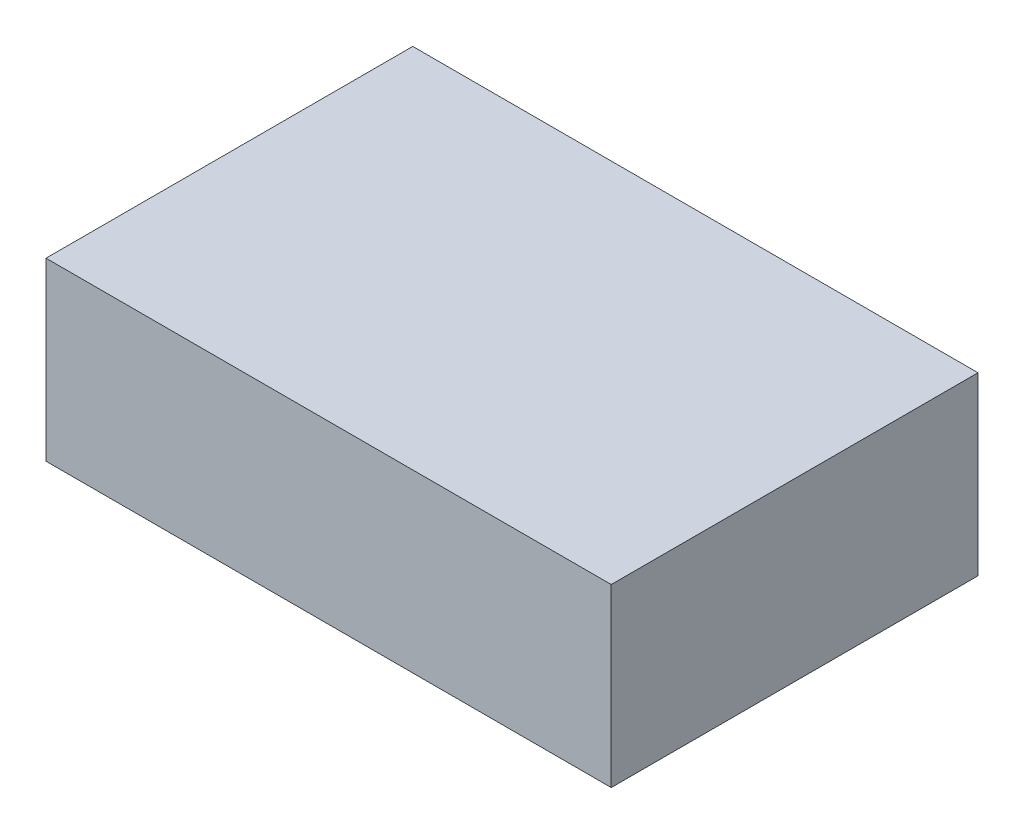
ISO-10303-21;
HEADER;
FILE_DESCRIPTION(('STEP AP214'),'2;1');
FILE_NAME('part.step','',(''),(''),'','','');
FILE_SCHEMA(('AUTOMOTIVE_DESIGN { 1 0 10303 214 1 1 1 1 }'));
ENDSEC;
DATA;
#1=APPLICATION_CONTEXT('core data for automotive mechanical design processes');
#2=APPLICATION_PROTOCOL_DEFINITION('international standard','automotive_design',2000,#1);
#3=PRODUCT_CONTEXT('',#1,'mechanical');
#4=PRODUCT('Part','Part','',(#3));
#5=PRODUCT_RELATED_PRODUCT_CATEGORY('part','',(#4));
#6=PRODUCT_DEFINITION_FORMATION('','',#4);
#7=PRODUCT_DEFINITION_CONTEXT('part definition',#1,'design');
#8=PRODUCT_DEFINITION('design','',#6,#7);
#9=PRODUCT_DEFINITION_SHAPE('','',#8);
#10=(LENGTH_UNIT() NAMED_UNIT(*) SI_UNIT(.MILLI.,.METRE.));
#11=(NAMED_UNIT(*) PLANE_ANGLE_UNIT() SI_UNIT($,.RADIAN.));
#12=(NAMED_UNIT(*) SI_UNIT($,.STERADIAN.) SOLID_ANGLE_UNIT());
#13=UNCERTAINTY_MEASURE_WITH_UNIT(LENGTH_MEASURE(1.E-05),#10,'distance_accuracy_value','');
#14=(GEOMETRIC_REPRESENTATION_CONTEXT(3) GLOBAL_UNCERTAINTY_ASSIGNED_CONTEXT((#13)) GLOBAL_UNIT_ASSIGNED_CONTEXT((#10,
#11,#12)) REPRESENTATION_CONTEXT('',''));
#15=CARTESIAN_POINT('',(0.,0.,0.));
#16=DIRECTION('',(0.,0.,1.));
#17=DIRECTION('',(1.,0.,0.));
#18=AXIS2_PLACEMENT_3D('',#15,#16,#17);
#19=CARTESIAN_POINT('',(-22.5,-7.,29.2));
#20=DIRECTION('',(0.,0.,1.));
#21=DIRECTION('',(1.,0.,0.));
#22=AXIS2_PLACEMENT_3D('',#19,#20,#21);
#23=PLANE('',#22);
#24=DIRECTION('',(0.,1.,0.));
#25=VECTOR('',#24,1.);
#26=CARTESIAN_POINT('',(-22.5,-7.,29.2));
#27=LINE('',#26,#25);
#28=CARTESIAN_POINT('',(-22.5,-7.,29.2));
#29=VERTEX_POINT('',#28);
#30=CARTESIAN_POINT('',(-22.5,7.,29.2));
#31=VERTEX_POINT('',#30);
#32=EDGE_CURVE('E155',#29,#31,#27,.T.);
#33=ORIENTED_EDGE('',*,*,#32,.F.);
#34=DIRECTION('',(1.,0.,0.));
#35=VECTOR('',#34,1.);
#36=CARTESIAN_POINT('',(-22.5,-7.,29.2));
#37=LINE('',#36,#35);
#38=CARTESIAN_POINT('',(22.5,-7.,29.2));
#39=VERTEX_POINT('',#38);
#40=EDGE_CURVE('E76',#29,#39,#37,.T.);
#41=ORIENTED_EDGE('',*,*,#40,.T.);
#42=DIRECTION('',(0.,1.,0.));
#43=VECTOR('',#42,1.);
#44=CARTESIAN_POINT('',(22.5,-7.,29.2));
#45=LINE('',#44,#43);
#46=CARTESIAN_POINT('',(22.5,7.,29.2));
#47=VERTEX_POINT('',#46);
#48=EDGE_CURVE('E88',#39,#47,#45,.T.);
#49=ORIENTED_EDGE('',*,*,#48,.T.);
#50=DIRECTION('',(1.,0.,0.));
#51=VECTOR('',#50,1.);
#52=CARTESIAN_POINT('',(-22.5,7.,29.2));
#53=LINE('',#52,#51);
#54=EDGE_CURVE('E10',#31,#47,#53,.T.);
#55=ORIENTED_EDGE('',*,*,#54,.F.);
#56=EDGE_LOOP('',(#33,#41,#49,#55));
#57=FACE_BOUND('',#56,.T.);
#58=ADVANCED_FACE('F16',(#57),#23,.T.);
#59=CARTESIAN_POINT('',(-22.5,-7.,0.));
#60=DIRECTION('',(0.,0.,1.));
#61=DIRECTION('',(1.,0.,0.));
#62=AXIS2_PLACEMENT_3D('',#59,#60,#61);
#63=PLANE('',#62);
#64=DIRECTION('',(1.,0.,0.));
#65=VECTOR('',#64,1.);
#66=CARTESIAN_POINT('',(-22.5,7.,0.));
#67=LINE('',#66,#65);
#68=CARTESIAN_POINT('',(-22.5,7.,0.));
#69=VERTEX_POINT('',#68);
#70=CARTESIAN_POINT('',(22.5,7.,0.));
#71=VERTEX_POINT('',#70);
#72=EDGE_CURVE('E24',#69,#71,#67,.T.);
#73=ORIENTED_EDGE('',*,*,#72,.T.);
#74=DIRECTION('',(0.,1.,0.));
#75=VECTOR('',#74,1.);
#76=CARTESIAN_POINT('',(22.5,-7.,0.));
#77=LINE('',#76,#75);
#78=CARTESIAN_POINT('',(22.5,-7.,0.));
#79=VERTEX_POINT('',#78);
#80=EDGE_CURVE('E79',#79,#71,#77,.T.);
#81=ORIENTED_EDGE('',*,*,#80,.F.);
#82=DIRECTION('',(1.,0.,0.));
#83=VECTOR('',#82,1.);
#84=CARTESIAN_POINT('',(-22.5,-7.,0.));
#85=LINE('',#84,#83);
#86=CARTESIAN_POINT('',(-22.5,-7.,0.));
#87=VERTEX_POINT('',#86);
#88=EDGE_CURVE('E67',#87,#79,#85,.T.);
#89=ORIENTED_EDGE('',*,*,#88,.F.);
#90=DIRECTION('',(0.,1.,0.));
#91=VECTOR('',#90,1.);
#92=CARTESIAN_POINT('',(-22.5,-7.,0.));
#93=LINE('',#92,#91);
#94=EDGE_CURVE('E95',#87,#69,#93,.T.);
#95=ORIENTED_EDGE('',*,*,#94,.T.);
#96=EDGE_LOOP('',(#73,#81,#89,#95));
#97=FACE_BOUND('',#96,.T.);
#98=ADVANCED_FACE('F80',(#97),#63,.F.);
#99=CARTESIAN_POINT('',(-22.5,7.,0.));
#100=DIRECTION('',(0.,1.,0.));
#101=DIRECTION('',(1.,0.,0.));
#102=AXIS2_PLACEMENT_3D('',#99,#100,#101);
#103=PLANE('',#102);
#104=ORIENTED_EDGE('',*,*,#72,.F.);
#105=DIRECTION('',(0.,0.,1.));
#106=VECTOR('',#105,1.);
#107=CARTESIAN_POINT('',(-22.5,7.,0.));
#108=LINE('',#107,#106);
#109=EDGE_CURVE('E99',#69,#31,#108,.T.);
#110=ORIENTED_EDGE('',*,*,#109,.T.);
#111=ORIENTED_EDGE('',*,*,#54,.T.);
#112=DIRECTION('',(0.,0.,1.));
#113=VECTOR('',#112,1.);
#114=CARTESIAN_POINT('',(22.5,7.,0.));
#115=LINE('',#114,#113);
#116=EDGE_CURVE('E84',#71,#47,#115,.T.);
#117=ORIENTED_EDGE('',*,*,#116,.F.);
#118=EDGE_LOOP('',(#104,#110,#111,#117));
#119=FACE_BOUND('',#118,.T.);
#120=ADVANCED_FACE('F113',(#119),#103,.T.);
#121=CARTESIAN_POINT('',(-22.5,-7.,0.));
#122=DIRECTION('',(0.,1.,0.));
#123=DIRECTION('',(1.,0.,0.));
#124=AXIS2_PLACEMENT_3D('',#121,#122,#123);
#125=PLANE('',#124);
#126=DIRECTION('',(0.,0.,1.));
#127=VECTOR('',#126,1.);
#128=CARTESIAN_POINT('',(22.5,-7.,0.));
#129=LINE('',#128,#127);
#130=EDGE_CURVE('E71',#79,#39,#129,.T.);
#131=ORIENTED_EDGE('',*,*,#130,.T.);
#132=ORIENTED_EDGE('',*,*,#40,.F.);
#133=DIRECTION('',(0.,0.,1.));
#134=VECTOR('',#133,1.);
#135=CARTESIAN_POINT('',(-22.5,-7.,0.));
#136=LINE('',#135,#134);
#137=EDGE_CURVE('E73',#87,#29,#136,.T.);
#138=ORIENTED_EDGE('',*,*,#137,.F.);
#139=ORIENTED_EDGE('',*,*,#88,.T.);
#140=EDGE_LOOP('',(#131,#132,#138,#139));
#141=FACE_BOUND('',#140,.T.);
#142=ADVANCED_FACE('F68',(#141),#125,.F.);
#143=CARTESIAN_POINT('',(22.5,-7.,0.));
#144=DIRECTION('',(1.,0.,0.));
#145=DIRECTION('',(0.,1.,0.));
#146=AXIS2_PLACEMENT_3D('',#143,#144,#145);
#147=PLANE('',#146);
#148=ORIENTED_EDGE('',*,*,#130,.F.);
#149=ORIENTED_EDGE('',*,*,#80,.T.);
#150=ORIENTED_EDGE('',*,*,#116,.T.);
#151=ORIENTED_EDGE('',*,*,#48,.F.);
#152=EDGE_LOOP('',(#148,#149,#150,#151));
#153=FACE_BOUND('',#152,.T.);
#154=ADVANCED_FACE('F87',(#153),#147,.T.);
#155=CARTESIAN_POINT('',(-22.5,-7.,0.));
#156=DIRECTION('',(1.,0.,0.));
#157=DIRECTION('',(0.,1.,0.));
#158=AXIS2_PLACEMENT_3D('',#155,#156,#157);
#159=PLANE('',#158);
#160=ORIENTED_EDGE('',*,*,#32,.T.);
#161=ORIENTED_EDGE('',*,*,#109,.F.);
#162=ORIENTED_EDGE('',*,*,#94,.F.);
#163=ORIENTED_EDGE('',*,*,#137,.T.);
#164=EDGE_LOOP('',(#160,#161,#162,#163));
#165=FACE_BOUND('',#164,.T.);
#166=ADVANCED_FACE('F122',(#165),#159,.F.);
#167=CLOSED_SHELL('',(#58,#98,#120,#142,#154,#166));
#168=MANIFOLD_SOLID_BREP('B1',#167);
#169=ADVANCED_BREP_SHAPE_REPRESENTATION('',(#18,#168),#14);
#170=SHAPE_DEFINITION_REPRESENTATION(#9,#169);
ENDSEC;
END-ISO-10303-21;
